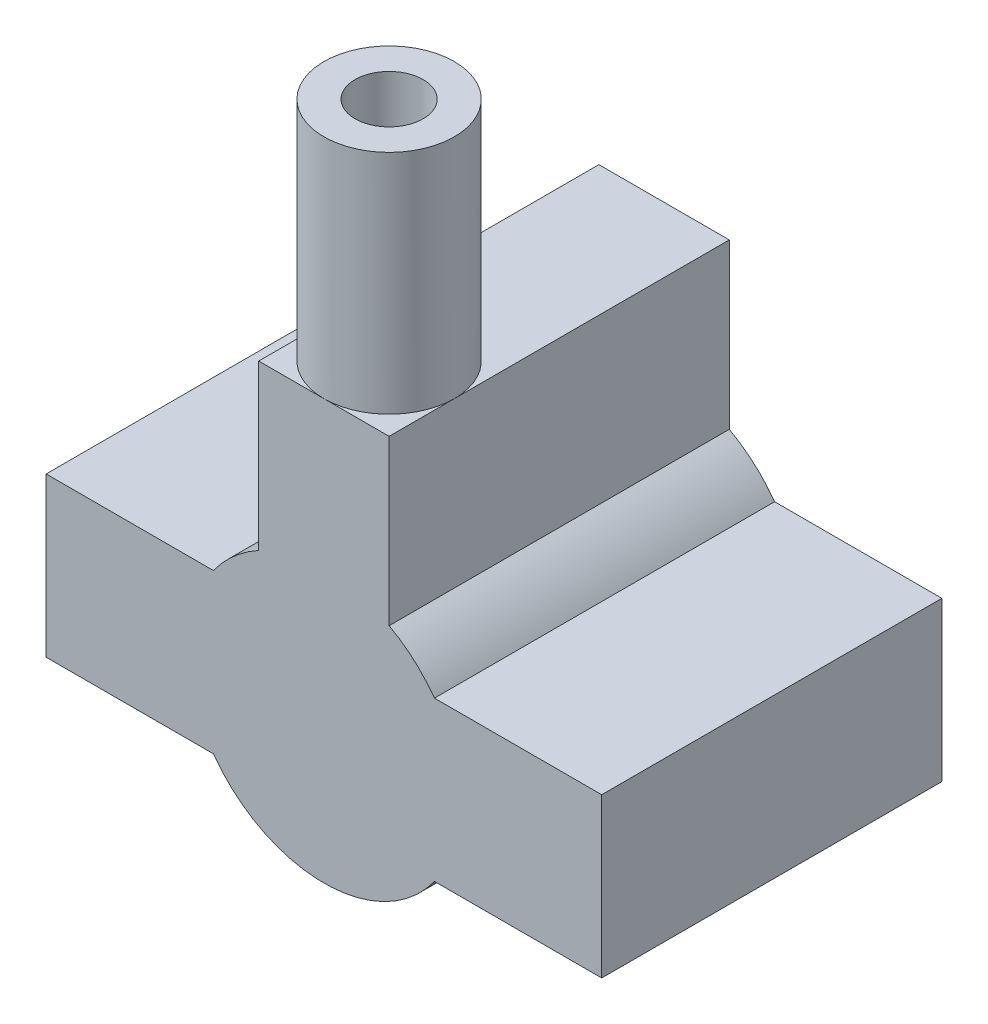
ISO-10303-21;
HEADER;
FILE_DESCRIPTION(('STEP AP214'),'2;1');
FILE_NAME('part.step','',(''),(''),'','','');
FILE_SCHEMA(('AUTOMOTIVE_DESIGN { 1 0 10303 214 1 1 1 1 }'));
ENDSEC;
DATA;
#1=APPLICATION_CONTEXT('core data for automotive mechanical design processes');
#2=APPLICATION_PROTOCOL_DEFINITION('international standard','automotive_design',2000,#1);
#3=PRODUCT_CONTEXT('',#1,'mechanical');
#4=PRODUCT('Part','Part','',(#3));
#5=PRODUCT_RELATED_PRODUCT_CATEGORY('part','',(#4));
#6=PRODUCT_DEFINITION_FORMATION('','',#4);
#7=PRODUCT_DEFINITION_CONTEXT('part definition',#1,'design');
#8=PRODUCT_DEFINITION('design','',#6,#7);
#9=PRODUCT_DEFINITION_SHAPE('','',#8);
#10=(LENGTH_UNIT() NAMED_UNIT(*) SI_UNIT(.MILLI.,.METRE.));
#11=(NAMED_UNIT(*) PLANE_ANGLE_UNIT() SI_UNIT($,.RADIAN.));
#12=(NAMED_UNIT(*) SI_UNIT($,.STERADIAN.) SOLID_ANGLE_UNIT());
#13=UNCERTAINTY_MEASURE_WITH_UNIT(LENGTH_MEASURE(1.E-05),#10,'distance_accuracy_value','');
#14=(GEOMETRIC_REPRESENTATION_CONTEXT(3) GLOBAL_UNCERTAINTY_ASSIGNED_CONTEXT((#13)) GLOBAL_UNIT_ASSIGNED_CONTEXT((#10,
#11,#12)) REPRESENTATION_CONTEXT('',''));
#15=CARTESIAN_POINT('',(0.,0.,0.));
#16=DIRECTION('',(0.,0.,1.));
#17=DIRECTION('',(1.,0.,0.));
#18=AXIS2_PLACEMENT_3D('',#15,#16,#17);
#19=CARTESIAN_POINT('',(0.,-5.00000000000001,-6.));
#20=DIRECTION('',(0.,1.,0.));
#21=DIRECTION('',(0.,0.,1.));
#22=AXIS2_PLACEMENT_3D('',#19,#20,#21);
#23=PLANE('',#22);
#24=CARTESIAN_POINT('',(-132.25,-5.00000000000001,-1.15000000000001));
#25=DIRECTION('',(0.,1.,0.));
#26=DIRECTION('',(0.,0.,1.));
#27=AXIS2_PLACEMENT_3D('',#24,#25,#26);
#28=CIRCLE('',#27,1.15000000000002);
#29=CARTESIAN_POINT('',(-132.25,-5.00000000000001,0.));
#30=VERTEX_POINT('',#29);
#31=CARTESIAN_POINT('',(-131.1,-5.00000000000001,-1.15000000000001));
#32=VERTEX_POINT('',#31);
#33=EDGE_CURVE('E47',#30,#32,#28,.T.);
#34=ORIENTED_EDGE('',*,*,#33,.F.);
#35=DIRECTION('',(-1.,0.,0.));
#36=VECTOR('',#35,1.);
#37=CARTESIAN_POINT('',(0.,-5.00000000000001,0.));
#38=LINE('',#37,#36);
#39=CARTESIAN_POINT('',(-131.1,-5.00000000000001,0.));
#40=VERTEX_POINT('',#39);
#41=EDGE_CURVE('E162',#40,#30,#38,.T.);
#42=ORIENTED_EDGE('',*,*,#41,.F.);
#43=DIRECTION('',(0.,0.,1.));
#44=VECTOR('',#43,1.);
#45=CARTESIAN_POINT('',(-131.1,-5.00000000000001,-6.));
#46=LINE('',#45,#44);
#47=EDGE_CURVE('E224',#32,#40,#46,.T.);
#48=ORIENTED_EDGE('',*,*,#47,.F.);
#49=EDGE_LOOP('',(#34,#42,#48));
#50=FACE_BOUND('',#49,.T.);
#51=ADVANCED_FACE('F36',(#50),#23,.T.);
#52=CARTESIAN_POINT('',(-133.4,-5.00000000000001,-1.15000000000001));
#53=VERTEX_POINT('',#52);
#54=EDGE_CURVE('E12',#32,#53,#28,.T.);
#55=ORIENTED_EDGE('',*,*,#54,.F.);
#56=CARTESIAN_POINT('',(-131.1,-5.00000000000001,-6.));
#57=VERTEX_POINT('',#56);
#58=EDGE_CURVE('E221',#57,#32,#46,.T.);
#59=ORIENTED_EDGE('',*,*,#58,.F.);
#60=DIRECTION('',(-1.,0.,0.));
#61=VECTOR('',#60,1.);
#62=CARTESIAN_POINT('',(0.,-5.00000000000001,-6.));
#63=LINE('',#62,#61);
#64=CARTESIAN_POINT('',(-133.4,-5.00000000000001,-6.));
#65=VERTEX_POINT('',#64);
#66=EDGE_CURVE('E185',#57,#65,#63,.T.);
#67=ORIENTED_EDGE('',*,*,#66,.T.);
#68=DIRECTION('',(0.,0.,1.));
#69=VECTOR('',#68,1.);
#70=CARTESIAN_POINT('',(-133.4,-5.00000000000001,-6.));
#71=LINE('',#70,#69);
#72=EDGE_CURVE('E218',#65,#53,#71,.T.);
#73=ORIENTED_EDGE('',*,*,#72,.T.);
#74=EDGE_LOOP('',(#55,#59,#67,#73));
#75=FACE_BOUND('',#74,.T.);
#76=ADVANCED_FACE('F271',(#75),#23,.T.);
#77=CARTESIAN_POINT('',(-133.4,0.,-6.));
#78=DIRECTION('',(1.,0.,0.));
#79=DIRECTION('',(0.,0.,-1.));
#80=AXIS2_PLACEMENT_3D('',#77,#78,#79);
#81=PLANE('',#80);
#82=DIRECTION('',(0.,1.,0.));
#83=VECTOR('',#82,1.);
#84=CARTESIAN_POINT('',(-133.4,0.,0.));
#85=LINE('',#84,#83);
#86=CARTESIAN_POINT('',(-133.4,-7.89346255670593,0.));
#87=VERTEX_POINT('',#86);
#88=CARTESIAN_POINT('',(-133.4,-5.00000000000001,0.));
#89=VERTEX_POINT('',#88);
#90=EDGE_CURVE('E158',#87,#89,#85,.T.);
#91=ORIENTED_EDGE('',*,*,#90,.T.);
#92=EDGE_CURVE('E220',#53,#89,#71,.T.);
#93=ORIENTED_EDGE('',*,*,#92,.F.);
#94=ORIENTED_EDGE('',*,*,#72,.F.);
#95=DIRECTION('',(0.,1.,0.));
#96=VECTOR('',#95,1.);
#97=CARTESIAN_POINT('',(-133.4,0.,-6.));
#98=LINE('',#97,#96);
#99=CARTESIAN_POINT('',(-133.4,-7.89346255670593,-6.));
#100=VERTEX_POINT('',#99);
#101=EDGE_CURVE('E159',#100,#65,#98,.T.);
#102=ORIENTED_EDGE('',*,*,#101,.F.);
#103=DIRECTION('',(0.,0.,1.));
#104=VECTOR('',#103,1.);
#105=CARTESIAN_POINT('',(-133.4,-7.89346255670593,-6.));
#106=LINE('',#105,#104);
#107=EDGE_CURVE('E40',#100,#87,#106,.T.);
#108=ORIENTED_EDGE('',*,*,#107,.T.);
#109=EDGE_LOOP('',(#91,#93,#94,#102,#108));
#110=FACE_BOUND('',#109,.T.);
#111=ADVANCED_FACE('F38',(#110),#81,.F.);
#112=EDGE_CURVE('E45',#53,#30,#28,.T.);
#113=ORIENTED_EDGE('',*,*,#112,.F.);
#114=ORIENTED_EDGE('',*,*,#92,.T.);
#115=EDGE_CURVE('E216',#30,#89,#38,.T.);
#116=ORIENTED_EDGE('',*,*,#115,.F.);
#117=EDGE_LOOP('',(#113,#114,#116));
#118=FACE_BOUND('',#117,.T.);
#119=ADVANCED_FACE('F274',(#118),#23,.T.);
#120=CARTESIAN_POINT('',(-131.1,0.,-6.));
#121=DIRECTION('',(-1.,0.,0.));
#122=DIRECTION('',(0.,0.,1.));
#123=AXIS2_PLACEMENT_3D('',#120,#121,#122);
#124=PLANE('',#123);
#125=DIRECTION('',(0.,-1.,0.));
#126=VECTOR('',#125,1.);
#127=CARTESIAN_POINT('',(-131.1,0.,0.));
#128=LINE('',#127,#126);
#129=CARTESIAN_POINT('',(-131.1,-7.89346255670593,0.));
#130=VERTEX_POINT('',#129);
#131=EDGE_CURVE('E213',#40,#130,#128,.T.);
#132=ORIENTED_EDGE('',*,*,#131,.T.);
#133=DIRECTION('',(0.,0.,1.));
#134=VECTOR('',#133,1.);
#135=CARTESIAN_POINT('',(-131.1,-7.89346255670593,-6.));
#136=LINE('',#135,#134);
#137=CARTESIAN_POINT('',(-131.1,-7.89346255670593,-6.));
#138=VERTEX_POINT('',#137);
#139=EDGE_CURVE('E225',#138,#130,#136,.T.);
#140=ORIENTED_EDGE('',*,*,#139,.F.);
#141=DIRECTION('',(0.,-1.,0.));
#142=VECTOR('',#141,1.);
#143=CARTESIAN_POINT('',(-131.1,0.,-6.));
#144=LINE('',#143,#142);
#145=EDGE_CURVE('E183',#57,#138,#144,.T.);
#146=ORIENTED_EDGE('',*,*,#145,.F.);
#147=ORIENTED_EDGE('',*,*,#58,.T.);
#148=ORIENTED_EDGE('',*,*,#47,.T.);
#149=EDGE_LOOP('',(#132,#140,#146,#147,#148));
#150=FACE_BOUND('',#149,.T.);
#151=ADVANCED_FACE('F282',(#150),#124,.F.);
#152=CARTESIAN_POINT('',(-132.25,-10.,-6.));
#153=DIRECTION('',(0.,0.,1.));
#154=DIRECTION('',(1.,0.,0.));
#155=AXIS2_PLACEMENT_3D('',#152,#153,#154);
#156=CYLINDRICAL_SURFACE('',#155,2.4);
#157=CARTESIAN_POINT('',(-132.25,-10.,0.));
#158=DIRECTION('',(0.,0.,1.));
#159=DIRECTION('',(1.,0.,0.));
#160=AXIS2_PLACEMENT_3D('',#157,#158,#159);
#161=CIRCLE('',#160,2.4);
#162=CARTESIAN_POINT('',(-130.300641131038,-8.60000000000001,0.));
#163=VERTEX_POINT('',#162);
#164=EDGE_CURVE('E210',#163,#130,#161,.T.);
#165=ORIENTED_EDGE('',*,*,#164,.F.);
#166=DIRECTION('',(0.,0.,1.));
#167=VECTOR('',#166,1.);
#168=CARTESIAN_POINT('',(-130.300641131038,-8.60000000000001,-6.));
#169=LINE('',#168,#167);
#170=CARTESIAN_POINT('',(-130.300641131038,-8.60000000000001,-6.));
#171=VERTEX_POINT('',#170);
#172=EDGE_CURVE('E227',#171,#163,#169,.T.);
#173=ORIENTED_EDGE('',*,*,#172,.F.);
#174=CARTESIAN_POINT('',(-132.25,-10.,-6.));
#175=DIRECTION('',(0.,0.,1.));
#176=DIRECTION('',(1.,0.,0.));
#177=AXIS2_PLACEMENT_3D('',#174,#175,#176);
#178=CIRCLE('',#177,2.4);
#179=EDGE_CURVE('E180',#171,#138,#178,.T.);
#180=ORIENTED_EDGE('',*,*,#179,.T.);
#181=ORIENTED_EDGE('',*,*,#139,.T.);
#182=EDGE_LOOP('',(#165,#173,#180,#181));
#183=FACE_BOUND('',#182,.T.);
#184=ADVANCED_FACE('F287',(#183),#156,.T.);
#185=CARTESIAN_POINT('',(0.,-8.59999999999971,-6.));
#186=DIRECTION('',(0.,-1.,0.));
#187=DIRECTION('',(1.,0.,0.));
#188=AXIS2_PLACEMENT_3D('',#185,#186,#187);
#189=PLANE('',#188);
#190=DIRECTION('',(1.,0.,0.));
#191=VECTOR('',#190,1.);
#192=CARTESIAN_POINT('',(0.,-8.59999999999971,0.));
#193=LINE('',#192,#191);
#194=CARTESIAN_POINT('',(-127.35,-8.60000000000001,0.));
#195=VERTEX_POINT('',#194);
#196=EDGE_CURVE('E208',#163,#195,#193,.T.);
#197=ORIENTED_EDGE('',*,*,#196,.T.);
#198=DIRECTION('',(0.,0.,1.));
#199=VECTOR('',#198,1.);
#200=CARTESIAN_POINT('',(-127.35,-8.60000000000001,-6.));
#201=LINE('',#200,#199);
#202=CARTESIAN_POINT('',(-127.35,-8.60000000000001,-6.));
#203=VERTEX_POINT('',#202);
#204=EDGE_CURVE('E229',#203,#195,#201,.T.);
#205=ORIENTED_EDGE('',*,*,#204,.F.);
#206=DIRECTION('',(1.,0.,0.));
#207=VECTOR('',#206,1.);
#208=CARTESIAN_POINT('',(0.,-8.59999999999971,-6.));
#209=LINE('',#208,#207);
#210=EDGE_CURVE('E178',#171,#203,#209,.T.);
#211=ORIENTED_EDGE('',*,*,#210,.F.);
#212=ORIENTED_EDGE('',*,*,#172,.T.);
#213=EDGE_LOOP('',(#197,#205,#211,#212));
#214=FACE_BOUND('',#213,.T.);
#215=ADVANCED_FACE('F367',(#214),#189,.F.);
#216=CARTESIAN_POINT('',(-127.35,0.,-6.));
#217=DIRECTION('',(-1.,0.,0.));
#218=DIRECTION('',(0.,0.,1.));
#219=AXIS2_PLACEMENT_3D('',#216,#217,#218);
#220=PLANE('',#219);
#221=DIRECTION('',(0.,-1.,0.));
#222=VECTOR('',#221,1.);
#223=CARTESIAN_POINT('',(-127.35,0.,0.));
#224=LINE('',#223,#222);
#225=CARTESIAN_POINT('',(-127.35,-11.4,0.));
#226=VERTEX_POINT('',#225);
#227=EDGE_CURVE('E206',#195,#226,#224,.T.);
#228=ORIENTED_EDGE('',*,*,#227,.T.);
#229=DIRECTION('',(0.,0.,1.));
#230=VECTOR('',#229,1.);
#231=CARTESIAN_POINT('',(-127.35,-11.4,-6.));
#232=LINE('',#231,#230);
#233=CARTESIAN_POINT('',(-127.35,-11.4,-6.));
#234=VERTEX_POINT('',#233);
#235=EDGE_CURVE('E232',#234,#226,#232,.T.);
#236=ORIENTED_EDGE('',*,*,#235,.F.);
#237=DIRECTION('',(0.,-1.,0.));
#238=VECTOR('',#237,1.);
#239=CARTESIAN_POINT('',(-127.35,0.,-6.));
#240=LINE('',#239,#238);
#241=EDGE_CURVE('E176',#203,#234,#240,.T.);
#242=ORIENTED_EDGE('',*,*,#241,.F.);
#243=ORIENTED_EDGE('',*,*,#204,.T.);
#244=EDGE_LOOP('',(#228,#236,#242,#243));
#245=FACE_BOUND('',#244,.T.);
#246=ADVANCED_FACE('F357',(#245),#220,.F.);
#247=CARTESIAN_POINT('',(0.,-11.4,-6.));
#248=DIRECTION('',(0.,1.,0.));
#249=DIRECTION('',(0.,0.,1.));
#250=AXIS2_PLACEMENT_3D('',#247,#248,#249);
#251=PLANE('',#250);
#252=DIRECTION('',(-1.,0.,0.));
#253=VECTOR('',#252,1.);
#254=CARTESIAN_POINT('',(0.,-11.4,0.));
#255=LINE('',#254,#253);
#256=CARTESIAN_POINT('',(-130.300641131038,-11.4,0.));
#257=VERTEX_POINT('',#256);
#258=EDGE_CURVE('E203',#226,#257,#255,.T.);
#259=ORIENTED_EDGE('',*,*,#258,.T.);
#260=DIRECTION('',(0.,0.,1.));
#261=VECTOR('',#260,1.);
#262=CARTESIAN_POINT('',(-130.300641131038,-11.4,-6.));
#263=LINE('',#262,#261);
#264=CARTESIAN_POINT('',(-130.300641131038,-11.4,-6.));
#265=VERTEX_POINT('',#264);
#266=EDGE_CURVE('E235',#265,#257,#263,.T.);
#267=ORIENTED_EDGE('',*,*,#266,.F.);
#268=DIRECTION('',(-1.,0.,0.));
#269=VECTOR('',#268,1.);
#270=CARTESIAN_POINT('',(0.,-11.4,-6.));
#271=LINE('',#270,#269);
#272=EDGE_CURVE('E174',#234,#265,#271,.T.);
#273=ORIENTED_EDGE('',*,*,#272,.F.);
#274=ORIENTED_EDGE('',*,*,#235,.T.);
#275=EDGE_LOOP('',(#259,#267,#273,#274));
#276=FACE_BOUND('',#275,.T.);
#277=ADVANCED_FACE('F347',(#276),#251,.F.);
#278=CARTESIAN_POINT('',(-132.25,-10.,-6.));
#279=DIRECTION('',(0.,0.,1.));
#280=DIRECTION('',(1.,0.,0.));
#281=AXIS2_PLACEMENT_3D('',#278,#279,#280);
#282=CYLINDRICAL_SURFACE('',#281,2.40000000000001);
#283=CARTESIAN_POINT('',(-132.25,-10.,0.));
#284=DIRECTION('',(0.,0.,1.));
#285=DIRECTION('',(1.,0.,0.));
#286=AXIS2_PLACEMENT_3D('',#283,#284,#285);
#287=CIRCLE('',#286,2.40000000000001);
#288=CARTESIAN_POINT('',(-134.199358868962,-11.4,0.));
#289=VERTEX_POINT('',#288);
#290=EDGE_CURVE('E200',#289,#257,#287,.T.);
#291=ORIENTED_EDGE('',*,*,#290,.F.);
#292=DIRECTION('',(0.,0.,1.));
#293=VECTOR('',#292,1.);
#294=CARTESIAN_POINT('',(-134.199358868962,-11.4,-6.));
#295=LINE('',#294,#293);
#296=CARTESIAN_POINT('',(-134.199358868962,-11.4,-6.));
#297=VERTEX_POINT('',#296);
#298=EDGE_CURVE('E237',#297,#289,#295,.T.);
#299=ORIENTED_EDGE('',*,*,#298,.F.);
#300=CARTESIAN_POINT('',(-132.25,-10.,-6.));
#301=DIRECTION('',(0.,0.,1.));
#302=DIRECTION('',(1.,0.,0.));
#303=AXIS2_PLACEMENT_3D('',#300,#301,#302);
#304=CIRCLE('',#303,2.40000000000001);
#305=EDGE_CURVE('E171',#297,#265,#304,.T.);
#306=ORIENTED_EDGE('',*,*,#305,.T.);
#307=ORIENTED_EDGE('',*,*,#266,.T.);
#308=EDGE_LOOP('',(#291,#299,#306,#307));
#309=FACE_BOUND('',#308,.T.);
#310=ADVANCED_FACE('F337',(#309),#282,.T.);
#311=CARTESIAN_POINT('',(0.,-11.4,-6.));
#312=DIRECTION('',(0.,1.,0.));
#313=DIRECTION('',(0.,0.,1.));
#314=AXIS2_PLACEMENT_3D('',#311,#312,#313);
#315=PLANE('',#314);
#316=DIRECTION('',(-1.,0.,0.));
#317=VECTOR('',#316,1.);
#318=CARTESIAN_POINT('',(0.,-11.4,0.));
#319=LINE('',#318,#317);
#320=CARTESIAN_POINT('',(-137.15,-11.4,0.));
#321=VERTEX_POINT('',#320);
#322=EDGE_CURVE('E198',#289,#321,#319,.T.);
#323=ORIENTED_EDGE('',*,*,#322,.T.);
#324=DIRECTION('',(0.,0.,1.));
#325=VECTOR('',#324,1.);
#326=CARTESIAN_POINT('',(-137.15,-11.4,-6.));
#327=LINE('',#326,#325);
#328=CARTESIAN_POINT('',(-137.15,-11.4,-6.));
#329=VERTEX_POINT('',#328);
#330=EDGE_CURVE('E239',#329,#321,#327,.T.);
#331=ORIENTED_EDGE('',*,*,#330,.F.);
#332=DIRECTION('',(-1.,0.,0.));
#333=VECTOR('',#332,1.);
#334=CARTESIAN_POINT('',(0.,-11.4,-6.));
#335=LINE('',#334,#333);
#336=EDGE_CURVE('E169',#297,#329,#335,.T.);
#337=ORIENTED_EDGE('',*,*,#336,.F.);
#338=ORIENTED_EDGE('',*,*,#298,.T.);
#339=EDGE_LOOP('',(#323,#331,#337,#338));
#340=FACE_BOUND('',#339,.T.);
#341=ADVANCED_FACE('F327',(#340),#315,.F.);
#342=CARTESIAN_POINT('',(-137.15,0.,-6.));
#343=DIRECTION('',(1.,0.,0.));
#344=DIRECTION('',(0.,0.,-1.));
#345=AXIS2_PLACEMENT_3D('',#342,#343,#344);
#346=PLANE('',#345);
#347=DIRECTION('',(0.,1.,0.));
#348=VECTOR('',#347,1.);
#349=CARTESIAN_POINT('',(-137.15,0.,0.));
#350=LINE('',#349,#348);
#351=CARTESIAN_POINT('',(-137.15,-8.60000000000001,0.));
#352=VERTEX_POINT('',#351);
#353=EDGE_CURVE('E196',#321,#352,#350,.T.);
#354=ORIENTED_EDGE('',*,*,#353,.T.);
#355=DIRECTION('',(0.,0.,1.));
#356=VECTOR('',#355,1.);
#357=CARTESIAN_POINT('',(-137.15,-8.60000000000001,-6.));
#358=LINE('',#357,#356);
#359=CARTESIAN_POINT('',(-137.15,-8.60000000000001,-6.));
#360=VERTEX_POINT('',#359);
#361=EDGE_CURVE('E242',#360,#352,#358,.T.);
#362=ORIENTED_EDGE('',*,*,#361,.F.);
#363=DIRECTION('',(0.,1.,0.));
#364=VECTOR('',#363,1.);
#365=CARTESIAN_POINT('',(-137.15,0.,-6.));
#366=LINE('',#365,#364);
#367=EDGE_CURVE('E167',#329,#360,#366,.T.);
#368=ORIENTED_EDGE('',*,*,#367,.F.);
#369=ORIENTED_EDGE('',*,*,#330,.T.);
#370=EDGE_LOOP('',(#354,#362,#368,#369));
#371=FACE_BOUND('',#370,.T.);
#372=ADVANCED_FACE('F267',(#371),#346,.F.);
#373=CARTESIAN_POINT('',(0.,-8.60000000000001,-6.));
#374=DIRECTION('',(0.,-1.,0.));
#375=DIRECTION('',(0.,0.,-1.));
#376=AXIS2_PLACEMENT_3D('',#373,#374,#375);
#377=PLANE('',#376);
#378=DIRECTION('',(1.,0.,0.));
#379=VECTOR('',#378,1.);
#380=CARTESIAN_POINT('',(0.,-8.60000000000001,0.));
#381=LINE('',#380,#379);
#382=CARTESIAN_POINT('',(-134.199358868962,-8.60000000000001,0.));
#383=VERTEX_POINT('',#382);
#384=EDGE_CURVE('E193',#352,#383,#381,.T.);
#385=ORIENTED_EDGE('',*,*,#384,.T.);
#386=DIRECTION('',(0.,0.,1.));
#387=VECTOR('',#386,1.);
#388=CARTESIAN_POINT('',(-134.199358868962,-8.60000000000001,-6.));
#389=LINE('',#388,#387);
#390=CARTESIAN_POINT('',(-134.199358868962,-8.60000000000001,-6.));
#391=VERTEX_POINT('',#390);
#392=EDGE_CURVE('E244',#391,#383,#389,.T.);
#393=ORIENTED_EDGE('',*,*,#392,.F.);
#394=DIRECTION('',(1.,0.,0.));
#395=VECTOR('',#394,1.);
#396=CARTESIAN_POINT('',(0.,-8.60000000000001,-6.));
#397=LINE('',#396,#395);
#398=EDGE_CURVE('E165',#360,#391,#397,.T.);
#399=ORIENTED_EDGE('',*,*,#398,.F.);
#400=ORIENTED_EDGE('',*,*,#361,.T.);
#401=EDGE_LOOP('',(#385,#393,#399,#400));
#402=FACE_BOUND('',#401,.T.);
#403=ADVANCED_FACE('F260',(#402),#377,.F.);
#404=CARTESIAN_POINT('',(-132.25,-10.,-6.));
#405=DIRECTION('',(0.,0.,1.));
#406=DIRECTION('',(1.,0.,0.));
#407=AXIS2_PLACEMENT_3D('',#404,#405,#406);
#408=CYLINDRICAL_SURFACE('',#407,2.4);
#409=CARTESIAN_POINT('',(-132.25,-10.,0.));
#410=DIRECTION('',(0.,0.,1.));
#411=DIRECTION('',(1.,0.,0.));
#412=AXIS2_PLACEMENT_3D('',#409,#410,#411);
#413=CIRCLE('',#412,2.4);
#414=EDGE_CURVE('E190',#87,#383,#413,.T.);
#415=ORIENTED_EDGE('',*,*,#414,.F.);
#416=ORIENTED_EDGE('',*,*,#107,.F.);
#417=CARTESIAN_POINT('',(-132.25,-10.,-6.));
#418=DIRECTION('',(0.,0.,1.));
#419=DIRECTION('',(1.,0.,0.));
#420=AXIS2_PLACEMENT_3D('',#417,#418,#419);
#421=CIRCLE('',#420,2.4);
#422=EDGE_CURVE('E161',#100,#391,#421,.T.);
#423=ORIENTED_EDGE('',*,*,#422,.T.);
#424=ORIENTED_EDGE('',*,*,#392,.T.);
#425=EDGE_LOOP('',(#415,#416,#423,#424));
#426=FACE_BOUND('',#425,.T.);
#427=ADVANCED_FACE('F257',(#426),#408,.T.);
#428=CARTESIAN_POINT('',(0.,0.,-6.));
#429=DIRECTION('',(0.,0.,1.));
#430=DIRECTION('',(1.,0.,0.));
#431=AXIS2_PLACEMENT_3D('',#428,#429,#430);
#432=PLANE('',#431);
#433=ORIENTED_EDGE('',*,*,#101,.T.);
#434=ORIENTED_EDGE('',*,*,#66,.F.);
#435=ORIENTED_EDGE('',*,*,#145,.T.);
#436=ORIENTED_EDGE('',*,*,#179,.F.);
#437=ORIENTED_EDGE('',*,*,#210,.T.);
#438=ORIENTED_EDGE('',*,*,#241,.T.);
#439=ORIENTED_EDGE('',*,*,#272,.T.);
#440=ORIENTED_EDGE('',*,*,#305,.F.);
#441=ORIENTED_EDGE('',*,*,#336,.T.);
#442=ORIENTED_EDGE('',*,*,#367,.T.);
#443=ORIENTED_EDGE('',*,*,#398,.T.);
#444=ORIENTED_EDGE('',*,*,#422,.F.);
#445=EDGE_LOOP('',(#433,#434,#435,#436,#437,#438,#439,#440,#441,#442,#443,#444));
#446=FACE_BOUND('',#445,.T.);
#447=ADVANCED_FACE('F259',(#446),#432,.F.);
#448=CARTESIAN_POINT('',(0.,0.,0.));
#449=DIRECTION('',(0.,0.,1.));
#450=DIRECTION('',(1.,0.,0.));
#451=AXIS2_PLACEMENT_3D('',#448,#449,#450);
#452=PLANE('',#451);
#453=ORIENTED_EDGE('',*,*,#90,.F.);
#454=ORIENTED_EDGE('',*,*,#414,.T.);
#455=ORIENTED_EDGE('',*,*,#384,.F.);
#456=ORIENTED_EDGE('',*,*,#353,.F.);
#457=ORIENTED_EDGE('',*,*,#322,.F.);
#458=ORIENTED_EDGE('',*,*,#290,.T.);
#459=ORIENTED_EDGE('',*,*,#258,.F.);
#460=ORIENTED_EDGE('',*,*,#227,.F.);
#461=ORIENTED_EDGE('',*,*,#196,.F.);
#462=ORIENTED_EDGE('',*,*,#164,.T.);
#463=ORIENTED_EDGE('',*,*,#131,.F.);
#464=ORIENTED_EDGE('',*,*,#41,.T.);
#465=ORIENTED_EDGE('',*,*,#115,.T.);
#466=EDGE_LOOP('',(#453,#454,#455,#456,#457,#458,#459,#460,#461,#462,#463,#464,#465));
#467=FACE_BOUND('',#466,.T.);
#468=ADVANCED_FACE('F255',(#467),#452,.T.);
#469=CARTESIAN_POINT('',(-132.25,3.25269119345815,-1.15000000000001));
#470=DIRECTION('',(0.,-1.,0.));
#471=DIRECTION('',(0.,0.,-1.));
#472=AXIS2_PLACEMENT_3D('',#469,#470,#471);
#473=CYLINDRICAL_SURFACE('',#472,1.15000000000002);
#474=CARTESIAN_POINT('',(-132.25,-1.00000000000001,-1.15000000000001));
#475=DIRECTION('',(0.,-1.,0.));
#476=DIRECTION('',(0.,0.,-1.));
#477=AXIS2_PLACEMENT_3D('',#474,#475,#476);
#478=CIRCLE('',#477,1.15000000000002);
#479=CARTESIAN_POINT('',(-132.25,-1.00000000000001,-2.30000000000003));
#480=VERTEX_POINT('',#479);
#481=EDGE_CURVE('E150',#480,#480,#478,.T.);
#482=ORIENTED_EDGE('',*,*,#481,.T.);
#483=EDGE_LOOP('',(#482));
#484=FACE_BOUND('',#483,.T.);
#485=ORIENTED_EDGE('',*,*,#33,.T.);
#486=ORIENTED_EDGE('',*,*,#54,.T.);
#487=ORIENTED_EDGE('',*,*,#112,.T.);
#488=EDGE_LOOP('',(#485,#486,#487));
#489=FACE_BOUND('',#488,.T.);
#490=ADVANCED_FACE('F401',(#484,#489),#473,.T.);
#491=CARTESIAN_POINT('',(-131.95,-1.00000000000001,10.8944271909998));
#492=DIRECTION('',(0.,-1.,0.));
#493=DIRECTION('',(0.,0.,1.));
#494=AXIS2_PLACEMENT_3D('',#491,#492,#493);
#495=PLANE('',#494);
#496=CARTESIAN_POINT('',(-132.25,-1.00000000000001,-1.15000000000001));
#497=DIRECTION('',(0.,1.,0.));
#498=DIRECTION('',(0.,0.,1.));
#499=AXIS2_PLACEMENT_3D('',#496,#497,#498);
#500=CIRCLE('',#499,0.599999999999989);
#501=CARTESIAN_POINT('',(-132.25,-1.00000000000001,-0.550000000000023));
#502=VERTEX_POINT('',#501);
#503=EDGE_CURVE('E460',#502,#502,#500,.T.);
#504=ORIENTED_EDGE('',*,*,#503,.F.);
#505=EDGE_LOOP('',(#504));
#506=FACE_BOUND('',#505,.T.);
#507=ORIENTED_EDGE('',*,*,#481,.F.);
#508=EDGE_LOOP('',(#507));
#509=FACE_BOUND('',#508,.T.);
#510=ADVANCED_FACE('F141',(#506,#509),#495,.F.);
#511=CARTESIAN_POINT('',(-132.25,-4.15000000000001,-1.15000000000001));
#512=DIRECTION('',(0.,1.,0.));
#513=DIRECTION('',(0.,0.,1.));
#514=AXIS2_PLACEMENT_3D('',#511,#512,#513);
#515=CONICAL_SURFACE('',#514,0.475000000000003,1.02974425867666);
#516=CARTESIAN_POINT('',(-132.25,-4.4354087940381,-1.15000000000001));
#517=VERTEX_POINT('',#516);
#518=VERTEX_LOOP('',#517);
#519=FACE_BOUND('',#518,.T.);
#520=CARTESIAN_POINT('',(-132.25,-4.15000000000001,-1.15000000000001));
#521=DIRECTION('',(0.,1.,0.));
#522=DIRECTION('',(0.,0.,1.));
#523=AXIS2_PLACEMENT_3D('',#520,#521,#522);
#524=CIRCLE('',#523,0.475000000000003);
#525=CARTESIAN_POINT('',(-132.25,-4.15000000000001,-0.675000000000009));
#526=VERTEX_POINT('',#525);
#527=EDGE_CURVE('E145',#526,#526,#524,.T.);
#528=ORIENTED_EDGE('',*,*,#527,.T.);
#529=EDGE_LOOP('',(#528));
#530=FACE_BOUND('',#529,.T.);
#531=ADVANCED_FACE('F137',(#519,#530),#515,.F.);
#532=CARTESIAN_POINT('',(-132.25,-1.00000000000001,-1.15000000000001));
#533=DIRECTION('',(0.,1.,0.));
#534=DIRECTION('',(0.,0.,1.));
#535=AXIS2_PLACEMENT_3D('',#532,#533,#534);
#536=CYLINDRICAL_SURFACE('',#535,0.475000000000003);
#537=ORIENTED_EDGE('',*,*,#527,.F.);
#538=EDGE_LOOP('',(#537));
#539=FACE_BOUND('',#538,.T.);
#540=CARTESIAN_POINT('',(-132.25,-3.40000000000001,-1.15000000000001));
#541=DIRECTION('',(0.,1.,0.));
#542=DIRECTION('',(0.,0.,1.));
#543=AXIS2_PLACEMENT_3D('',#540,#541,#542);
#544=CIRCLE('',#543,0.475000000000003);
#545=CARTESIAN_POINT('',(-132.25,-3.40000000000001,-0.675000000000009));
#546=VERTEX_POINT('',#545);
#547=EDGE_CURVE('E147',#546,#546,#544,.T.);
#548=ORIENTED_EDGE('',*,*,#547,.T.);
#549=EDGE_LOOP('',(#548));
#550=FACE_BOUND('',#549,.T.);
#551=ADVANCED_FACE('F140',(#539,#550),#536,.F.);
#552=CARTESIAN_POINT('',(-131.775,-3.40000000000001,-1.15000000000001));
#553=DIRECTION('',(0.,-1.,0.));
#554=DIRECTION('',(0.,0.,-1.));
#555=AXIS2_PLACEMENT_3D('',#552,#553,#554);
#556=PLANE('',#555);
#557=ORIENTED_EDGE('',*,*,#547,.F.);
#558=EDGE_LOOP('',(#557));
#559=FACE_BOUND('',#558,.T.);
#560=CARTESIAN_POINT('',(-132.25,-3.40000000000001,-1.15000000000001));
#561=DIRECTION('',(0.,1.,0.));
#562=DIRECTION('',(0.,0.,1.));
#563=AXIS2_PLACEMENT_3D('',#560,#561,#562);
#564=CIRCLE('',#563,0.599999999999989);
#565=CARTESIAN_POINT('',(-132.25,-3.40000000000001,-0.550000000000023));
#566=VERTEX_POINT('',#565);
#567=EDGE_CURVE('E152',#566,#566,#564,.T.);
#568=ORIENTED_EDGE('',*,*,#567,.T.);
#569=EDGE_LOOP('',(#568));
#570=FACE_BOUND('',#569,.T.);
#571=ADVANCED_FACE('F432',(#559,#570),#556,.F.);
#572=CARTESIAN_POINT('',(-132.25,-1.00000000000001,-1.15000000000001));
#573=DIRECTION('',(0.,1.,0.));
#574=DIRECTION('',(0.,0.,1.));
#575=AXIS2_PLACEMENT_3D('',#572,#573,#574);
#576=CYLINDRICAL_SURFACE('',#575,0.599999999999989);
#577=ORIENTED_EDGE('',*,*,#567,.F.);
#578=EDGE_LOOP('',(#577));
#579=FACE_BOUND('',#578,.T.);
#580=ORIENTED_EDGE('',*,*,#503,.T.);
#581=EDGE_LOOP('',(#580));
#582=FACE_BOUND('',#581,.T.);
#583=ADVANCED_FACE('F441',(#579,#582),#576,.F.);
#584=CLOSED_SHELL('',(#51,#76,#111,#119,#151,#184,#215,#246,#277,#310,#341,#372,#403,#427,#447,
#468,#490,#510,#531,#551,#571,#583));
#585=MANIFOLD_SOLID_BREP('B2',#584);
#586=ADVANCED_BREP_SHAPE_REPRESENTATION('',(#18,#585),#14);
#587=SHAPE_DEFINITION_REPRESENTATION(#9,#586);
ENDSEC;
END-ISO-10303-21;
